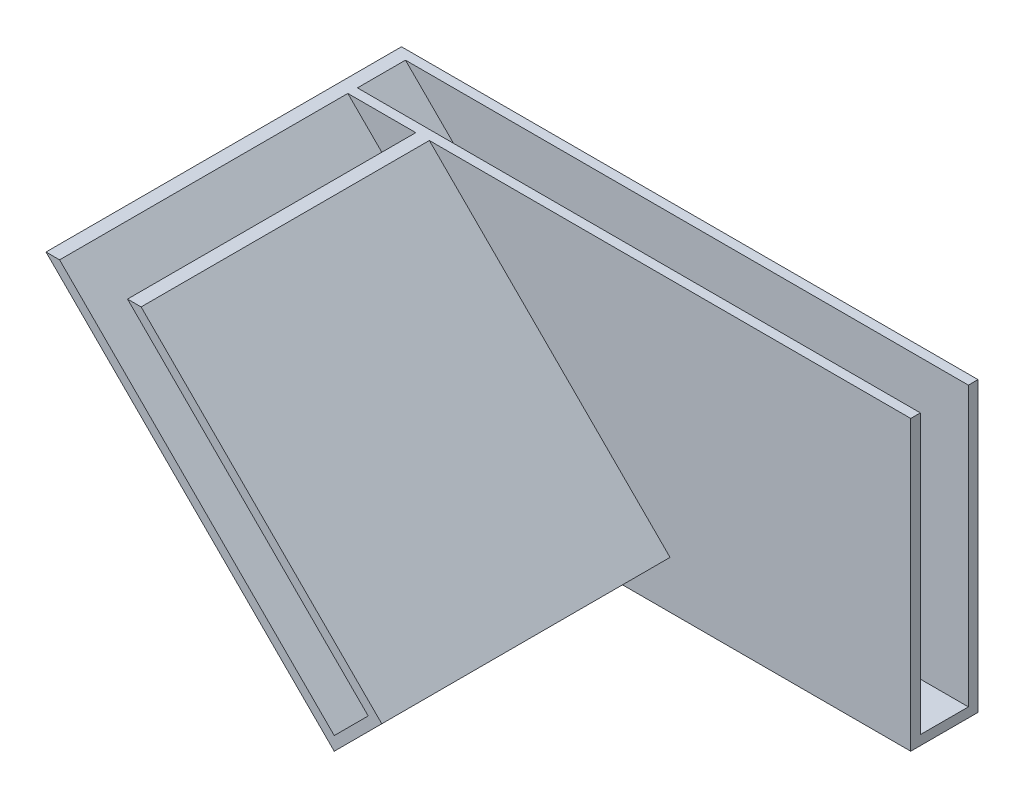
ISO-10303-21;
HEADER;
FILE_DESCRIPTION(('STEP AP214'),'2;1');
FILE_NAME('part.step','',(''),(''),'','','');
FILE_SCHEMA(('AUTOMOTIVE_DESIGN { 1 0 10303 214 1 1 1 1 }'));
ENDSEC;
DATA;
#1=APPLICATION_CONTEXT('core data for automotive mechanical design processes');
#2=APPLICATION_PROTOCOL_DEFINITION('international standard','automotive_design',2000,#1);
#3=PRODUCT_CONTEXT('',#1,'mechanical');
#4=PRODUCT('Part','Part','',(#3));
#5=PRODUCT_RELATED_PRODUCT_CATEGORY('part','',(#4));
#6=PRODUCT_DEFINITION_FORMATION('','',#4);
#7=PRODUCT_DEFINITION_CONTEXT('part definition',#1,'design');
#8=PRODUCT_DEFINITION('design','',#6,#7);
#9=PRODUCT_DEFINITION_SHAPE('','',#8);
#10=(LENGTH_UNIT() NAMED_UNIT(*) SI_UNIT(.MILLI.,.METRE.));
#11=(NAMED_UNIT(*) PLANE_ANGLE_UNIT() SI_UNIT($,.RADIAN.));
#12=(NAMED_UNIT(*) SI_UNIT($,.STERADIAN.) SOLID_ANGLE_UNIT());
#13=UNCERTAINTY_MEASURE_WITH_UNIT(LENGTH_MEASURE(1.E-05),#10,'distance_accuracy_value','');
#14=(GEOMETRIC_REPRESENTATION_CONTEXT(3) GLOBAL_UNCERTAINTY_ASSIGNED_CONTEXT((#13)) GLOBAL_UNIT_ASSIGNED_CONTEXT((#10,
#11,#12)) REPRESENTATION_CONTEXT('',''));
#15=CARTESIAN_POINT('',(0.,0.,0.));
#16=DIRECTION('',(0.,0.,1.));
#17=DIRECTION('',(1.,0.,0.));
#18=AXIS2_PLACEMENT_3D('',#15,#16,#17);
#19=CARTESIAN_POINT('',(0.,0.,7.));
#20=DIRECTION('',(0.,0.,-1.));
#21=DIRECTION('',(-1.,0.,0.));
#22=AXIS2_PLACEMENT_3D('',#19,#20,#21);
#23=PLANE('',#22);
#24=DIRECTION('',(-0.707106781186548,0.707106781186547,0.));
#25=VECTOR('',#24,1.);
#26=CARTESIAN_POINT('',(4.94974746830583,4.94974746830583,7.));
#27=LINE('',#26,#25);
#28=CARTESIAN_POINT('',(4.94974746830583,4.94974746830583,7.));
#29=VERTEX_POINT('',#28);
#30=CARTESIAN_POINT('',(-20.1005050633883,30.,7.));
#31=VERTEX_POINT('',#30);
#32=EDGE_CURVE('E174',#29,#31,#27,.T.);
#33=ORIENTED_EDGE('',*,*,#32,.F.);
#34=DIRECTION('',(0.707106781186548,0.707106781186548,0.));
#35=VECTOR('',#34,1.);
#36=CARTESIAN_POINT('',(0.,0.,7.));
#37=LINE('',#36,#35);
#38=CARTESIAN_POINT('',(0.,0.,7.));
#39=VERTEX_POINT('',#38);
#40=EDGE_CURVE('E171',#39,#29,#37,.T.);
#41=ORIENTED_EDGE('',*,*,#40,.F.);
#42=DIRECTION('',(1.,0.,0.));
#43=VECTOR('',#42,1.);
#44=CARTESIAN_POINT('',(0.,0.,7.));
#45=LINE('',#44,#43);
#46=CARTESIAN_POINT('',(30.,0.,7.));
#47=VERTEX_POINT('',#46);
#48=EDGE_CURVE('E221',#39,#47,#45,.T.);
#49=ORIENTED_EDGE('',*,*,#48,.T.);
#50=DIRECTION('',(0.,1.,0.));
#51=VECTOR('',#50,1.);
#52=CARTESIAN_POINT('',(30.,0.,7.));
#53=LINE('',#52,#51);
#54=CARTESIAN_POINT('',(30.,30.,7.));
#55=VERTEX_POINT('',#54);
#56=EDGE_CURVE('E223',#47,#55,#53,.T.);
#57=ORIENTED_EDGE('',*,*,#56,.T.);
#58=DIRECTION('',(-1.,0.,0.));
#59=VECTOR('',#58,1.);
#60=CARTESIAN_POINT('',(0.,30.,7.));
#61=LINE('',#60,#59);
#62=EDGE_CURVE('E55',#55,#31,#61,.T.);
#63=ORIENTED_EDGE('',*,*,#62,.T.);
#64=EDGE_LOOP('',(#33,#41,#49,#57,#63));
#65=FACE_BOUND('',#64,.T.);
#66=ADVANCED_FACE('F32',(#65),#23,.F.);
#67=CARTESIAN_POINT('',(30.,0.,7.));
#68=DIRECTION('',(-1.,0.,0.));
#69=DIRECTION('',(0.,0.,1.));
#70=AXIS2_PLACEMENT_3D('',#67,#68,#69);
#71=PLANE('',#70);
#72=DIRECTION('',(0.,1.,0.));
#73=VECTOR('',#72,1.);
#74=CARTESIAN_POINT('',(30.,0.,1.));
#75=LINE('',#74,#73);
#76=CARTESIAN_POINT('',(30.,1.,1.));
#77=VERTEX_POINT('',#76);
#78=CARTESIAN_POINT('',(30.,30.,1.));
#79=VERTEX_POINT('',#78);
#80=EDGE_CURVE('E196',#77,#79,#75,.T.);
#81=ORIENTED_EDGE('',*,*,#80,.F.);
#82=DIRECTION('',(0.,0.,-1.));
#83=VECTOR('',#82,1.);
#84=CARTESIAN_POINT('',(30.,1.,7.));
#85=LINE('',#84,#83);
#86=CARTESIAN_POINT('',(30.,1.,6.));
#87=VERTEX_POINT('',#86);
#88=EDGE_CURVE('E201',#87,#77,#85,.T.);
#89=ORIENTED_EDGE('',*,*,#88,.F.);
#90=DIRECTION('',(0.,1.,0.));
#91=VECTOR('',#90,1.);
#92=CARTESIAN_POINT('',(30.,0.,6.));
#93=LINE('',#92,#91);
#94=CARTESIAN_POINT('',(30.,30.,6.));
#95=VERTEX_POINT('',#94);
#96=EDGE_CURVE('E189',#87,#95,#93,.T.);
#97=ORIENTED_EDGE('',*,*,#96,.T.);
#98=DIRECTION('',(0.,0.,-1.));
#99=VECTOR('',#98,1.);
#100=CARTESIAN_POINT('',(30.,30.,7.));
#101=LINE('',#100,#99);
#102=EDGE_CURVE('E40',#55,#95,#101,.T.);
#103=ORIENTED_EDGE('',*,*,#102,.F.);
#104=ORIENTED_EDGE('',*,*,#56,.F.);
#105=DIRECTION('',(0.,0.,-1.));
#106=VECTOR('',#105,1.);
#107=CARTESIAN_POINT('',(30.,0.,7.));
#108=LINE('',#107,#106);
#109=CARTESIAN_POINT('',(30.,0.,0.));
#110=VERTEX_POINT('',#109);
#111=EDGE_CURVE('E11',#47,#110,#108,.T.);
#112=ORIENTED_EDGE('',*,*,#111,.T.);
#113=DIRECTION('',(0.,1.,0.));
#114=VECTOR('',#113,1.);
#115=CARTESIAN_POINT('',(30.,0.,0.));
#116=LINE('',#115,#114);
#117=CARTESIAN_POINT('',(30.,30.,0.));
#118=VERTEX_POINT('',#117);
#119=EDGE_CURVE('E229',#110,#118,#116,.T.);
#120=ORIENTED_EDGE('',*,*,#119,.T.);
#121=EDGE_CURVE('E227',#79,#118,#101,.T.);
#122=ORIENTED_EDGE('',*,*,#121,.F.);
#123=EDGE_LOOP('',(#81,#89,#97,#103,#104,#112,#120,#122));
#124=FACE_BOUND('',#123,.T.);
#125=ADVANCED_FACE('F240',(#124),#71,.F.);
#126=CARTESIAN_POINT('',(0.,30.,7.));
#127=DIRECTION('',(0.,-1.,0.));
#128=DIRECTION('',(0.,0.,-1.));
#129=AXIS2_PLACEMENT_3D('',#126,#127,#128);
#130=PLANE('',#129);
#131=DIRECTION('',(-1.,0.,0.));
#132=VECTOR('',#131,1.);
#133=CARTESIAN_POINT('',(-20.1005050633883,30.,37.));
#134=LINE('',#133,#132);
#135=CARTESIAN_POINT('',(-28.5857864376269,30.,37.));
#136=VERTEX_POINT('',#135);
#137=CARTESIAN_POINT('',(-30.,30.,37.));
#138=VERTEX_POINT('',#137);
#139=EDGE_CURVE('E153',#136,#138,#134,.T.);
#140=ORIENTED_EDGE('',*,*,#139,.F.);
#141=DIRECTION('',(0.,0.,-1.));
#142=VECTOR('',#141,1.);
#143=CARTESIAN_POINT('',(-28.5857864376269,30.,-23.));
#144=LINE('',#143,#142);
#145=CARTESIAN_POINT('',(-28.5857864376269,30.,7.));
#146=VERTEX_POINT('',#145);
#147=EDGE_CURVE('E135',#136,#146,#144,.T.);
#148=ORIENTED_EDGE('',*,*,#147,.T.);
#149=DIRECTION('',(-1.,0.,0.));
#150=VECTOR('',#149,1.);
#151=CARTESIAN_POINT('',(0.,30.,7.));
#152=LINE('',#151,#150);
#153=CARTESIAN_POINT('',(-21.5147186257614,30.,7.));
#154=VERTEX_POINT('',#153);
#155=EDGE_CURVE('E147',#154,#146,#152,.T.);
#156=ORIENTED_EDGE('',*,*,#155,.F.);
#157=DIRECTION('',(0.,0.,-1.));
#158=VECTOR('',#157,1.);
#159=CARTESIAN_POINT('',(-21.5147186257614,30.,7.));
#160=LINE('',#159,#158);
#161=CARTESIAN_POINT('',(-21.5147186257614,30.,37.));
#162=VERTEX_POINT('',#161);
#163=EDGE_CURVE('E263',#162,#154,#160,.T.);
#164=ORIENTED_EDGE('',*,*,#163,.F.);
#165=CARTESIAN_POINT('',(-20.1005050633883,30.,37.));
#166=VERTEX_POINT('',#165);
#167=EDGE_CURVE('E162',#166,#162,#134,.T.);
#168=ORIENTED_EDGE('',*,*,#167,.F.);
#169=DIRECTION('',(0.,0.,-1.));
#170=VECTOR('',#169,1.);
#171=CARTESIAN_POINT('',(-20.1005050633883,30.,37.));
#172=LINE('',#171,#170);
#173=EDGE_CURVE('E166',#166,#31,#172,.T.);
#174=ORIENTED_EDGE('',*,*,#173,.T.);
#175=ORIENTED_EDGE('',*,*,#62,.F.);
#176=ORIENTED_EDGE('',*,*,#102,.T.);
#177=DIRECTION('',(-1.,0.,0.));
#178=VECTOR('',#177,1.);
#179=CARTESIAN_POINT('',(0.,30.,6.));
#180=LINE('',#179,#178);
#181=CARTESIAN_POINT('',(-28.5857864376269,30.,6.));
#182=VERTEX_POINT('',#181);
#183=EDGE_CURVE('E205',#95,#182,#180,.T.);
#184=ORIENTED_EDGE('',*,*,#183,.T.);
#185=DIRECTION('',(0.,0.,-1.));
#186=VECTOR('',#185,1.);
#187=CARTESIAN_POINT('',(-28.5857864376269,30.,-23.));
#188=LINE('',#187,#186);
#189=CARTESIAN_POINT('',(-28.5857864376269,30.,1.));
#190=VERTEX_POINT('',#189);
#191=EDGE_CURVE('E197',#182,#190,#188,.T.);
#192=ORIENTED_EDGE('',*,*,#191,.T.);
#193=DIRECTION('',(-1.,0.,0.));
#194=VECTOR('',#193,1.);
#195=CARTESIAN_POINT('',(0.,30.,1.));
#196=LINE('',#195,#194);
#197=EDGE_CURVE('E190',#79,#190,#196,.T.);
#198=ORIENTED_EDGE('',*,*,#197,.F.);
#199=ORIENTED_EDGE('',*,*,#121,.T.);
#200=DIRECTION('',(-1.,0.,0.));
#201=VECTOR('',#200,1.);
#202=CARTESIAN_POINT('',(0.,30.,0.));
#203=LINE('',#202,#201);
#204=CARTESIAN_POINT('',(-30.,30.,0.));
#205=VERTEX_POINT('',#204);
#206=EDGE_CURVE('E224',#118,#205,#203,.T.);
#207=ORIENTED_EDGE('',*,*,#206,.T.);
#208=DIRECTION('',(0.,0.,-1.));
#209=VECTOR('',#208,1.);
#210=CARTESIAN_POINT('',(-30.,30.,7.));
#211=LINE('',#210,#209);
#212=EDGE_CURVE('E160',#138,#205,#211,.T.);
#213=ORIENTED_EDGE('',*,*,#212,.F.);
#214=EDGE_LOOP('',(#140,#148,#156,#164,#168,#174,#175,#176,#184,#192,#198,#199,#207,#213));
#215=FACE_BOUND('',#214,.T.);
#216=ADVANCED_FACE('F158',(#215),#130,.F.);
#217=CARTESIAN_POINT('',(0.,0.,7.));
#218=DIRECTION('',(0.,1.,0.));
#219=DIRECTION('',(0.,0.,1.));
#220=AXIS2_PLACEMENT_3D('',#217,#218,#219);
#221=PLANE('',#220);
#222=ORIENTED_EDGE('',*,*,#48,.F.);
#223=DIRECTION('',(0.,0.,1.));
#224=VECTOR('',#223,1.);
#225=CARTESIAN_POINT('',(0.,0.,-23.));
#226=LINE('',#225,#224);
#227=CARTESIAN_POINT('',(0.,0.,0.));
#228=VERTEX_POINT('',#227);
#229=EDGE_CURVE('E204',#228,#39,#226,.T.);
#230=ORIENTED_EDGE('',*,*,#229,.F.);
#231=DIRECTION('',(1.,0.,0.));
#232=VECTOR('',#231,1.);
#233=CARTESIAN_POINT('',(0.,0.,0.));
#234=LINE('',#233,#232);
#235=EDGE_CURVE('E220',#228,#110,#234,.T.);
#236=ORIENTED_EDGE('',*,*,#235,.T.);
#237=ORIENTED_EDGE('',*,*,#111,.F.);
#238=EDGE_LOOP('',(#222,#230,#236,#237));
#239=FACE_BOUND('',#238,.T.);
#240=ADVANCED_FACE('F34',(#239),#221,.F.);
#241=CARTESIAN_POINT('',(0.,0.,0.));
#242=DIRECTION('',(0.,0.,-1.));
#243=DIRECTION('',(-1.,0.,0.));
#244=AXIS2_PLACEMENT_3D('',#241,#242,#243);
#245=PLANE('',#244);
#246=DIRECTION('',(0.707106781186548,-0.707106781186548,0.));
#247=VECTOR('',#246,1.);
#248=CARTESIAN_POINT('',(0.,0.,0.));
#249=LINE('',#248,#247);
#250=EDGE_CURVE('E217',#205,#228,#249,.T.);
#251=ORIENTED_EDGE('',*,*,#250,.F.);
#252=ORIENTED_EDGE('',*,*,#206,.F.);
#253=ORIENTED_EDGE('',*,*,#119,.F.);
#254=ORIENTED_EDGE('',*,*,#235,.F.);
#255=EDGE_LOOP('',(#251,#252,#253,#254));
#256=FACE_BOUND('',#255,.T.);
#257=ADVANCED_FACE('F246',(#256),#245,.T.);
#258=CARTESIAN_POINT('',(-30.,30.,-23.));
#259=DIRECTION('',(0.707106781186547,0.707106781186547,0.));
#260=DIRECTION('',(-0.707106781186548,0.707106781186548,0.));
#261=AXIS2_PLACEMENT_3D('',#258,#259,#260);
#262=PLANE('',#261);
#263=ORIENTED_EDGE('',*,*,#250,.T.);
#264=ORIENTED_EDGE('',*,*,#229,.T.);
#265=DIRECTION('',(0.,0.,-1.));
#266=VECTOR('',#265,1.);
#267=CARTESIAN_POINT('',(0.,0.,37.));
#268=LINE('',#267,#266);
#269=CARTESIAN_POINT('',(0.,0.,37.));
#270=VERTEX_POINT('',#269);
#271=EDGE_CURVE('E183',#270,#39,#268,.T.);
#272=ORIENTED_EDGE('',*,*,#271,.F.);
#273=DIRECTION('',(0.707106781186547,-0.707106781186547,0.));
#274=VECTOR('',#273,1.);
#275=CARTESIAN_POINT('',(-30.,30.,37.));
#276=LINE('',#275,#274);
#277=EDGE_CURVE('E177',#138,#270,#276,.T.);
#278=ORIENTED_EDGE('',*,*,#277,.F.);
#279=ORIENTED_EDGE('',*,*,#212,.T.);
#280=EDGE_LOOP('',(#263,#264,#272,#278,#279));
#281=FACE_BOUND('',#280,.T.);
#282=ADVANCED_FACE('F249',(#281),#262,.F.);
#283=CARTESIAN_POINT('',(0.,1.,7.));
#284=DIRECTION('',(0.,1.,0.));
#285=DIRECTION('',(0.,0.,1.));
#286=AXIS2_PLACEMENT_3D('',#283,#284,#285);
#287=PLANE('',#286);
#288=DIRECTION('',(1.,0.,0.));
#289=VECTOR('',#288,1.);
#290=CARTESIAN_POINT('',(0.,1.,6.));
#291=LINE('',#290,#289);
#292=CARTESIAN_POINT('',(0.414213562373096,1.,6.));
#293=VERTEX_POINT('',#292);
#294=EDGE_CURVE('E187',#293,#87,#291,.T.);
#295=ORIENTED_EDGE('',*,*,#294,.T.);
#296=ORIENTED_EDGE('',*,*,#88,.T.);
#297=DIRECTION('',(1.,0.,0.));
#298=VECTOR('',#297,1.);
#299=CARTESIAN_POINT('',(0.,1.,1.));
#300=LINE('',#299,#298);
#301=CARTESIAN_POINT('',(0.414213562373096,1.,1.));
#302=VERTEX_POINT('',#301);
#303=EDGE_CURVE('E194',#302,#77,#300,.T.);
#304=ORIENTED_EDGE('',*,*,#303,.F.);
#305=DIRECTION('',(0.,0.,1.));
#306=VECTOR('',#305,1.);
#307=CARTESIAN_POINT('',(0.414213562373096,1.,-23.));
#308=LINE('',#307,#306);
#309=EDGE_CURVE('E191',#302,#293,#308,.T.);
#310=ORIENTED_EDGE('',*,*,#309,.T.);
#311=EDGE_LOOP('',(#295,#296,#304,#310));
#312=FACE_BOUND('',#311,.T.);
#313=ADVANCED_FACE('F309',(#312),#287,.T.);
#314=CARTESIAN_POINT('',(0.,0.,6.));
#315=DIRECTION('',(0.,0.,-1.));
#316=DIRECTION('',(-1.,0.,0.));
#317=AXIS2_PLACEMENT_3D('',#314,#315,#316);
#318=PLANE('',#317);
#319=ORIENTED_EDGE('',*,*,#183,.F.);
#320=ORIENTED_EDGE('',*,*,#96,.F.);
#321=ORIENTED_EDGE('',*,*,#294,.F.);
#322=DIRECTION('',(-0.707106781186548,0.707106781186548,0.));
#323=VECTOR('',#322,1.);
#324=CARTESIAN_POINT('',(-29.2928932188135,30.7071067811865,6.));
#325=LINE('',#324,#323);
#326=EDGE_CURVE('E186',#293,#182,#325,.T.);
#327=ORIENTED_EDGE('',*,*,#326,.T.);
#328=EDGE_LOOP('',(#319,#320,#321,#327));
#329=FACE_BOUND('',#328,.T.);
#330=ADVANCED_FACE('F316',(#329),#318,.T.);
#331=CARTESIAN_POINT('',(0.,0.,1.));
#332=DIRECTION('',(0.,0.,-1.));
#333=DIRECTION('',(-1.,0.,0.));
#334=AXIS2_PLACEMENT_3D('',#331,#332,#333);
#335=PLANE('',#334);
#336=DIRECTION('',(0.707106781186548,-0.707106781186548,0.));
#337=VECTOR('',#336,1.);
#338=CARTESIAN_POINT('',(0.707106781186548,0.707106781186548,1.));
#339=LINE('',#338,#337);
#340=EDGE_CURVE('E193',#190,#302,#339,.T.);
#341=ORIENTED_EDGE('',*,*,#340,.T.);
#342=ORIENTED_EDGE('',*,*,#303,.T.);
#343=ORIENTED_EDGE('',*,*,#80,.T.);
#344=ORIENTED_EDGE('',*,*,#197,.T.);
#345=EDGE_LOOP('',(#341,#342,#343,#344));
#346=FACE_BOUND('',#345,.T.);
#347=ADVANCED_FACE('F324',(#346),#335,.F.);
#348=CARTESIAN_POINT('',(-29.2928932188135,30.7071067811865,-23.));
#349=DIRECTION('',(0.707106781186547,0.707106781186547,0.));
#350=DIRECTION('',(-0.707106781186548,0.707106781186548,0.));
#351=AXIS2_PLACEMENT_3D('',#348,#349,#350);
#352=PLANE('',#351);
#353=ORIENTED_EDGE('',*,*,#340,.F.);
#354=ORIENTED_EDGE('',*,*,#191,.F.);
#355=ORIENTED_EDGE('',*,*,#326,.F.);
#356=ORIENTED_EDGE('',*,*,#309,.F.);
#357=EDGE_LOOP('',(#353,#354,#355,#356));
#358=FACE_BOUND('',#357,.T.);
#359=ADVANCED_FACE('F332',(#358),#352,.T.);
#360=CARTESIAN_POINT('',(0.,0.,37.));
#361=DIRECTION('',(-0.707106781186547,0.707106781186547,0.));
#362=DIRECTION('',(-0.707106781186548,-0.707106781186548,0.));
#363=AXIS2_PLACEMENT_3D('',#360,#361,#362);
#364=PLANE('',#363);
#365=ORIENTED_EDGE('',*,*,#40,.T.);
#366=DIRECTION('',(0.,0.,-1.));
#367=VECTOR('',#366,1.);
#368=CARTESIAN_POINT('',(4.94974746830583,4.94974746830583,37.));
#369=LINE('',#368,#367);
#370=CARTESIAN_POINT('',(4.94974746830583,4.94974746830583,37.));
#371=VERTEX_POINT('',#370);
#372=EDGE_CURVE('E180',#371,#29,#369,.T.);
#373=ORIENTED_EDGE('',*,*,#372,.F.);
#374=DIRECTION('',(0.707106781186548,0.707106781186548,0.));
#375=VECTOR('',#374,1.);
#376=CARTESIAN_POINT('',(0.,0.,37.));
#377=LINE('',#376,#375);
#378=EDGE_CURVE('E167',#270,#371,#377,.T.);
#379=ORIENTED_EDGE('',*,*,#378,.F.);
#380=ORIENTED_EDGE('',*,*,#271,.T.);
#381=EDGE_LOOP('',(#365,#373,#379,#380));
#382=FACE_BOUND('',#381,.T.);
#383=ADVANCED_FACE('F254',(#382),#364,.F.);
#384=CARTESIAN_POINT('',(4.94974746830583,4.94974746830583,37.));
#385=DIRECTION('',(-0.707106781186547,-0.707106781186548,0.));
#386=DIRECTION('',(0.707106781186548,-0.707106781186547,0.));
#387=AXIS2_PLACEMENT_3D('',#384,#385,#386);
#388=PLANE('',#387);
#389=ORIENTED_EDGE('',*,*,#32,.T.);
#390=ORIENTED_EDGE('',*,*,#173,.F.);
#391=DIRECTION('',(-0.707106781186548,0.707106781186547,0.));
#392=VECTOR('',#391,1.);
#393=CARTESIAN_POINT('',(4.94974746830583,4.94974746830583,37.));
#394=LINE('',#393,#392);
#395=EDGE_CURVE('E163',#371,#166,#394,.T.);
#396=ORIENTED_EDGE('',*,*,#395,.F.);
#397=ORIENTED_EDGE('',*,*,#372,.T.);
#398=EDGE_LOOP('',(#389,#390,#396,#397));
#399=FACE_BOUND('',#398,.T.);
#400=ADVANCED_FACE('F281',(#399),#388,.F.);
#401=CARTESIAN_POINT('',(0.,0.,37.));
#402=DIRECTION('',(0.,0.,1.));
#403=DIRECTION('',(1.,0.,0.));
#404=AXIS2_PLACEMENT_3D('',#401,#402,#403);
#405=PLANE('',#404);
#406=DIRECTION('',(0.707106781186548,-0.707106781186548,0.));
#407=VECTOR('',#406,1.);
#408=CARTESIAN_POINT('',(-29.2928932188135,30.7071067811865,37.));
#409=LINE('',#408,#407);
#410=CARTESIAN_POINT('',(0.,1.4142135623731,37.));
#411=VERTEX_POINT('',#410);
#412=EDGE_CURVE('E139',#136,#411,#409,.T.);
#413=ORIENTED_EDGE('',*,*,#412,.F.);
#414=ORIENTED_EDGE('',*,*,#139,.T.);
#415=ORIENTED_EDGE('',*,*,#277,.T.);
#416=ORIENTED_EDGE('',*,*,#378,.T.);
#417=ORIENTED_EDGE('',*,*,#395,.T.);
#418=ORIENTED_EDGE('',*,*,#167,.T.);
#419=DIRECTION('',(-0.707106781186548,0.707106781186547,0.));
#420=VECTOR('',#419,1.);
#421=CARTESIAN_POINT('',(4.24264068711928,4.24264068711928,37.));
#422=LINE('',#421,#420);
#423=CARTESIAN_POINT('',(3.53553390593274,4.94974746830583,37.));
#424=VERTEX_POINT('',#423);
#425=EDGE_CURVE('E266',#424,#162,#422,.T.);
#426=ORIENTED_EDGE('',*,*,#425,.F.);
#427=DIRECTION('',(0.707106781186548,0.707106781186548,0.));
#428=VECTOR('',#427,1.);
#429=CARTESIAN_POINT('',(-0.707106781186547,0.707106781186547,37.));
#430=LINE('',#429,#428);
#431=EDGE_CURVE('E156',#411,#424,#430,.T.);
#432=ORIENTED_EDGE('',*,*,#431,.F.);
#433=EDGE_LOOP('',(#413,#414,#415,#416,#417,#418,#426,#432));
#434=FACE_BOUND('',#433,.T.);
#435=ADVANCED_FACE('F151',(#434),#405,.T.);
#436=CARTESIAN_POINT('',(-29.2928932188135,30.7071067811865,-23.));
#437=DIRECTION('',(0.707106781186547,0.707106781186547,0.));
#438=DIRECTION('',(-0.707106781186548,0.707106781186548,0.));
#439=AXIS2_PLACEMENT_3D('',#436,#437,#438);
#440=PLANE('',#439);
#441=DIRECTION('',(-0.707106781186548,0.707106781186548,0.));
#442=VECTOR('',#441,1.);
#443=CARTESIAN_POINT('',(-29.2928932188135,30.7071067811865,7.));
#444=LINE('',#443,#442);
#445=CARTESIAN_POINT('',(0.,1.4142135623731,7.));
#446=VERTEX_POINT('',#445);
#447=EDGE_CURVE('E142',#446,#146,#444,.T.);
#448=ORIENTED_EDGE('',*,*,#447,.T.);
#449=ORIENTED_EDGE('',*,*,#147,.F.);
#450=ORIENTED_EDGE('',*,*,#412,.T.);
#451=DIRECTION('',(0.,0.,-1.));
#452=VECTOR('',#451,1.);
#453=CARTESIAN_POINT('',(0.,1.4142135623731,37.));
#454=LINE('',#453,#452);
#455=EDGE_CURVE('E270',#411,#446,#454,.T.);
#456=ORIENTED_EDGE('',*,*,#455,.T.);
#457=EDGE_LOOP('',(#448,#449,#450,#456));
#458=FACE_BOUND('',#457,.T.);
#459=ADVANCED_FACE('F137',(#458),#440,.T.);
#460=CARTESIAN_POINT('',(0.,0.,7.));
#461=DIRECTION('',(0.,0.,-1.));
#462=DIRECTION('',(-1.,0.,0.));
#463=AXIS2_PLACEMENT_3D('',#460,#461,#462);
#464=PLANE('',#463);
#465=DIRECTION('',(0.707106781186548,0.707106781186548,0.));
#466=VECTOR('',#465,1.);
#467=CARTESIAN_POINT('',(-0.707106781186547,0.707106781186547,7.));
#468=LINE('',#467,#466);
#469=CARTESIAN_POINT('',(3.53553390593274,4.94974746830583,7.));
#470=VERTEX_POINT('',#469);
#471=EDGE_CURVE('E175',#446,#470,#468,.T.);
#472=ORIENTED_EDGE('',*,*,#471,.T.);
#473=DIRECTION('',(-0.707106781186548,0.707106781186547,0.));
#474=VECTOR('',#473,1.);
#475=CARTESIAN_POINT('',(4.24264068711928,4.24264068711929,7.));
#476=LINE('',#475,#474);
#477=EDGE_CURVE('E260',#470,#154,#476,.T.);
#478=ORIENTED_EDGE('',*,*,#477,.T.);
#479=ORIENTED_EDGE('',*,*,#155,.T.);
#480=ORIENTED_EDGE('',*,*,#447,.F.);
#481=EDGE_LOOP('',(#472,#478,#479,#480));
#482=FACE_BOUND('',#481,.T.);
#483=ADVANCED_FACE('F275',(#482),#464,.F.);
#484=CARTESIAN_POINT('',(-0.707106781186547,0.707106781186547,37.));
#485=DIRECTION('',(-0.707106781186547,0.707106781186547,0.));
#486=DIRECTION('',(-0.707106781186548,-0.707106781186548,0.));
#487=AXIS2_PLACEMENT_3D('',#484,#485,#486);
#488=PLANE('',#487);
#489=ORIENTED_EDGE('',*,*,#455,.F.);
#490=ORIENTED_EDGE('',*,*,#431,.T.);
#491=DIRECTION('',(0.,0.,-1.));
#492=VECTOR('',#491,1.);
#493=CARTESIAN_POINT('',(3.53553390593274,4.94974746830583,37.));
#494=LINE('',#493,#492);
#495=EDGE_CURVE('E47',#424,#470,#494,.T.);
#496=ORIENTED_EDGE('',*,*,#495,.T.);
#497=ORIENTED_EDGE('',*,*,#471,.F.);
#498=EDGE_LOOP('',(#489,#490,#496,#497));
#499=FACE_BOUND('',#498,.T.);
#500=ADVANCED_FACE('F273',(#499),#488,.T.);
#501=CARTESIAN_POINT('',(4.24264068711928,4.24264068711928,37.));
#502=DIRECTION('',(-0.707106781186547,-0.707106781186548,0.));
#503=DIRECTION('',(0.707106781186548,-0.707106781186547,0.));
#504=AXIS2_PLACEMENT_3D('',#501,#502,#503);
#505=PLANE('',#504);
#506=ORIENTED_EDGE('',*,*,#495,.F.);
#507=ORIENTED_EDGE('',*,*,#425,.T.);
#508=ORIENTED_EDGE('',*,*,#163,.T.);
#509=ORIENTED_EDGE('',*,*,#477,.F.);
#510=EDGE_LOOP('',(#506,#507,#508,#509));
#511=FACE_BOUND('',#510,.T.);
#512=ADVANCED_FACE('F375',(#511),#505,.T.);
#513=CLOSED_SHELL('',(#66,#125,#216,#240,#257,#282,#313,#330,#347,#359,#383,#400,#435,#459,#483,
#500,#512));
#514=MANIFOLD_SOLID_BREP('B2',#513);
#515=ADVANCED_BREP_SHAPE_REPRESENTATION('',(#18,#514),#14);
#516=SHAPE_DEFINITION_REPRESENTATION(#9,#515);
ENDSEC;
END-ISO-10303-21;
